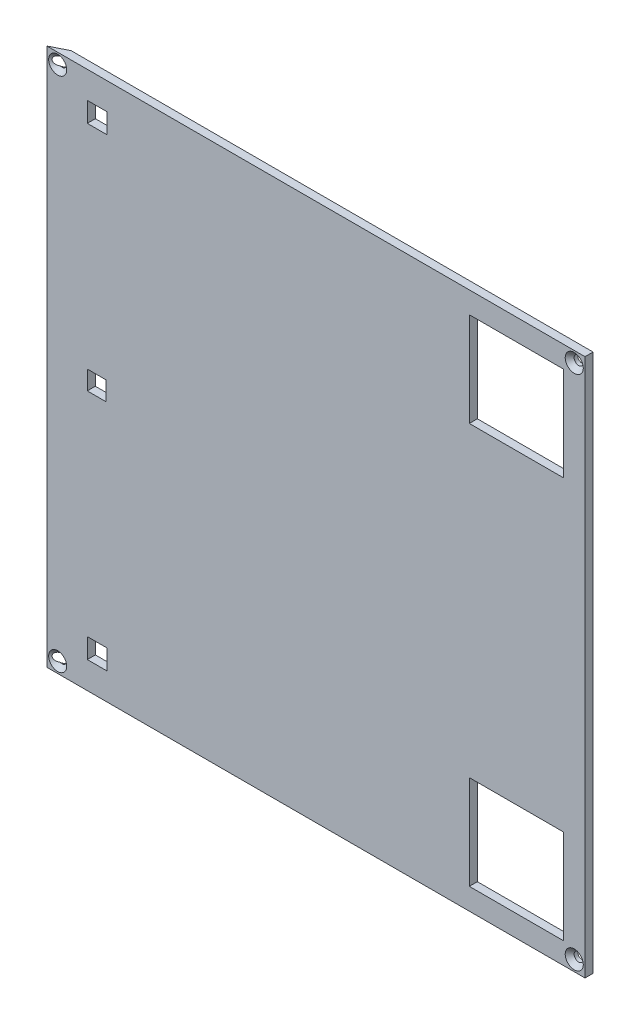
ISO-10303-21;
HEADER;
FILE_DESCRIPTION(('STEP AP214'),'2;1');
FILE_NAME('part.step','',(''),(''),'','','');
FILE_SCHEMA(('AUTOMOTIVE_DESIGN { 1 0 10303 214 1 1 1 1 }'));
ENDSEC;
DATA;
#1=APPLICATION_CONTEXT('core data for automotive mechanical design processes');
#2=APPLICATION_PROTOCOL_DEFINITION('international standard','automotive_design',2000,#1);
#3=PRODUCT_CONTEXT('',#1,'mechanical');
#4=PRODUCT('Part','Part','',(#3));
#5=PRODUCT_RELATED_PRODUCT_CATEGORY('part','',(#4));
#6=PRODUCT_DEFINITION_FORMATION('','',#4);
#7=PRODUCT_DEFINITION_CONTEXT('part definition',#1,'design');
#8=PRODUCT_DEFINITION('design','',#6,#7);
#9=PRODUCT_DEFINITION_SHAPE('','',#8);
#10=(LENGTH_UNIT() NAMED_UNIT(*) SI_UNIT(.MILLI.,.METRE.));
#11=(NAMED_UNIT(*) PLANE_ANGLE_UNIT() SI_UNIT($,.RADIAN.));
#12=(NAMED_UNIT(*) SI_UNIT($,.STERADIAN.) SOLID_ANGLE_UNIT());
#13=UNCERTAINTY_MEASURE_WITH_UNIT(LENGTH_MEASURE(1.E-05),#10,'distance_accuracy_value','');
#14=(GEOMETRIC_REPRESENTATION_CONTEXT(3) GLOBAL_UNCERTAINTY_ASSIGNED_CONTEXT((#13)) GLOBAL_UNIT_ASSIGNED_CONTEXT((#10,
#11,#12)) REPRESENTATION_CONTEXT('',''));
#15=CARTESIAN_POINT('',(0.,0.,0.));
#16=DIRECTION('',(0.,0.,1.));
#17=DIRECTION('',(1.,0.,0.));
#18=AXIS2_PLACEMENT_3D('',#15,#16,#17);
#19=CARTESIAN_POINT('',(4.,196.,0.));
#20=DIRECTION('',(0.,0.,1.));
#21=DIRECTION('',(1.,0.,0.));
#22=AXIS2_PLACEMENT_3D('',#19,#20,#21);
#23=CONICAL_SURFACE('',#22,3.36,0.785398163397445);
#24=CARTESIAN_POINT('',(4.,196.,0.));
#25=DIRECTION('',(0.,0.,1.));
#26=DIRECTION('',(1.,0.,0.));
#27=AXIS2_PLACEMENT_3D('',#24,#25,#26);
#28=CIRCLE('',#27,3.36);
#29=CARTESIAN_POINT('',(7.36,196.,0.));
#30=VERTEX_POINT('',#29);
#31=EDGE_CURVE('E216',#30,#30,#28,.T.);
#32=ORIENTED_EDGE('',*,*,#31,.T.);
#33=EDGE_LOOP('',(#32));
#34=FACE_BOUND('',#33,.T.);
#35=CARTESIAN_POINT('',(4.,196.,-1.66000000000002));
#36=DIRECTION('',(0.,0.,1.));
#37=DIRECTION('',(1.,0.,0.));
#38=AXIS2_PLACEMENT_3D('',#35,#36,#37);
#39=CIRCLE('',#38,1.69999999999999);
#40=CARTESIAN_POINT('',(3.32000000000006,194.441924263715,-1.66000000000002));
#41=VERTEX_POINT('',#40);
#42=CARTESIAN_POINT('',(3.32000000000006,197.558075736285,-1.66000000000002));
#43=VERTEX_POINT('',#42);
#44=EDGE_CURVE('E267',#41,#43,#39,.T.);
#45=ORIENTED_EDGE('',*,*,#44,.F.);
#46=CARTESIAN_POINT('',(3.09333333333334,196.,-1.54666666666666));
#47=DIRECTION('',(0.447213595499958,0.,0.894427190999916));
#48=DIRECTION('',(-0.894427190999916,0.,0.447213595499958));
#49=AXIS2_PLACEMENT_3D('',#46,#47,#48);
#50=ELLIPSE('',#49,2.02736829959983,1.5703927321958);
#51=EDGE_CURVE('E212',#43,#41,#50,.T.);
#52=ORIENTED_EDGE('',*,*,#51,.F.);
#53=EDGE_LOOP('',(#45,#52));
#54=FACE_BOUND('',#53,.T.);
#55=ADVANCED_FACE('F33',(#34,#54),#23,.F.);
#56=CARTESIAN_POINT('',(4.,196.,0.));
#57=DIRECTION('',(0.,0.,1.));
#58=DIRECTION('',(1.,0.,0.));
#59=AXIS2_PLACEMENT_3D('',#56,#57,#58);
#60=CYLINDRICAL_SURFACE('',#59,1.69999999999999);
#61=ORIENTED_EDGE('',*,*,#44,.T.);
#62=CARTESIAN_POINT('',(4.,196.,-1.99999999999999));
#63=DIRECTION('',(0.447213595499958,0.,0.894427190999916));
#64=DIRECTION('',(-0.894427190999916,0.,0.447213595499958));
#65=AXIS2_PLACEMENT_3D('',#62,#63,#64);
#66=ELLIPSE('',#65,1.90065778087481,1.69999999999999);
#67=EDGE_CURVE('E261',#41,#43,#66,.T.);
#68=ORIENTED_EDGE('',*,*,#67,.F.);
#69=EDGE_LOOP('',(#61,#68));
#70=FACE_BOUND('',#69,.T.);
#71=ADVANCED_FACE('F735',(#70),#60,.F.);
#72=CARTESIAN_POINT('',(4.,4.,0.));
#73=DIRECTION('',(0.,0.,1.));
#74=DIRECTION('',(1.,0.,0.));
#75=AXIS2_PLACEMENT_3D('',#72,#73,#74);
#76=CONICAL_SURFACE('',#75,3.36,0.785398163397445);
#77=CARTESIAN_POINT('',(4.,4.,0.));
#78=DIRECTION('',(0.,0.,1.));
#79=DIRECTION('',(1.,0.,0.));
#80=AXIS2_PLACEMENT_3D('',#77,#78,#79);
#81=CIRCLE('',#80,3.36);
#82=CARTESIAN_POINT('',(7.36,4.,0.));
#83=VERTEX_POINT('',#82);
#84=EDGE_CURVE('E217',#83,#83,#81,.T.);
#85=ORIENTED_EDGE('',*,*,#84,.T.);
#86=EDGE_LOOP('',(#85));
#87=FACE_BOUND('',#86,.T.);
#88=CARTESIAN_POINT('',(4.,4.,-1.66000000000002));
#89=DIRECTION('',(0.,0.,1.));
#90=DIRECTION('',(1.,0.,0.));
#91=AXIS2_PLACEMENT_3D('',#88,#89,#90);
#92=CIRCLE('',#91,1.69999999999999);
#93=CARTESIAN_POINT('',(3.32000000000006,2.441924263715,-1.66000000000002));
#94=VERTEX_POINT('',#93);
#95=CARTESIAN_POINT('',(3.32000000000006,5.558075736285,-1.66000000000002));
#96=VERTEX_POINT('',#95);
#97=EDGE_CURVE('E207',#94,#96,#92,.T.);
#98=ORIENTED_EDGE('',*,*,#97,.F.);
#99=CARTESIAN_POINT('',(3.09333333333334,4.,-1.54666666666666));
#100=DIRECTION('',(0.447213595499958,0.,0.894427190999916));
#101=DIRECTION('',(-0.894427190999916,0.,0.447213595499958));
#102=AXIS2_PLACEMENT_3D('',#99,#100,#101);
#103=ELLIPSE('',#102,2.02736829959983,1.5703927321958);
#104=EDGE_CURVE('E211',#96,#94,#103,.T.);
#105=ORIENTED_EDGE('',*,*,#104,.F.);
#106=EDGE_LOOP('',(#98,#105));
#107=FACE_BOUND('',#106,.T.);
#108=ADVANCED_FACE('F215',(#87,#107),#76,.F.);
#109=CARTESIAN_POINT('',(4.,4.,0.));
#110=DIRECTION('',(0.,0.,1.));
#111=DIRECTION('',(1.,0.,0.));
#112=AXIS2_PLACEMENT_3D('',#109,#110,#111);
#113=CYLINDRICAL_SURFACE('',#112,1.69999999999999);
#114=ORIENTED_EDGE('',*,*,#97,.T.);
#115=CARTESIAN_POINT('',(4.,4.,-1.99999999999999));
#116=DIRECTION('',(0.447213595499958,0.,0.894427190999916));
#117=DIRECTION('',(-0.894427190999916,0.,0.447213595499958));
#118=AXIS2_PLACEMENT_3D('',#115,#116,#117);
#119=ELLIPSE('',#118,1.90065778087481,1.69999999999999);
#120=EDGE_CURVE('E204',#94,#96,#119,.T.);
#121=ORIENTED_EDGE('',*,*,#120,.F.);
#122=EDGE_LOOP('',(#114,#121));
#123=FACE_BOUND('',#122,.T.);
#124=ADVANCED_FACE('F206',(#123),#113,.F.);
#125=CARTESIAN_POINT('',(160.,200.,-80.));
#126=DIRECTION('',(0.447213595499958,0.,0.894427190999916));
#127=DIRECTION('',(0.894427190999916,0.,-0.447213595499958));
#128=AXIS2_PLACEMENT_3D('',#125,#126,#127);
#129=PLANE('',#128);
#130=ORIENTED_EDGE('',*,*,#120,.T.);
#131=ORIENTED_EDGE('',*,*,#104,.T.);
#132=EDGE_LOOP('',(#130,#131));
#133=FACE_BOUND('',#132,.T.);
#134=ORIENTED_EDGE('',*,*,#67,.T.);
#135=ORIENTED_EDGE('',*,*,#51,.T.);
#136=EDGE_LOOP('',(#134,#135));
#137=FACE_BOUND('',#136,.T.);
#138=DIRECTION('',(-0.894427190999916,0.,0.447213595499958));
#139=VECTOR('',#138,1.);
#140=CARTESIAN_POINT('',(160.,200.,-80.));
#141=LINE('',#140,#139);
#142=CARTESIAN_POINT('',(6.00000000000003,200.,-3.00000000000001));
#143=VERTEX_POINT('',#142);
#144=CARTESIAN_POINT('',(0.,200.,0.));
#145=VERTEX_POINT('',#144);
#146=EDGE_CURVE('E233',#143,#145,#141,.T.);
#147=ORIENTED_EDGE('',*,*,#146,.F.);
#148=DIRECTION('',(0.,-1.,0.));
#149=VECTOR('',#148,1.);
#150=CARTESIAN_POINT('',(6.00000000000001,200.,-3.));
#151=LINE('',#150,#149);
#152=CARTESIAN_POINT('',(6.00000000000003,0.,-3.00000000000001));
#153=VERTEX_POINT('',#152);
#154=EDGE_CURVE('E41',#143,#153,#151,.T.);
#155=ORIENTED_EDGE('',*,*,#154,.T.);
#156=DIRECTION('',(-0.894427190999916,0.,0.447213595499958));
#157=VECTOR('',#156,1.);
#158=CARTESIAN_POINT('',(160.,0.,-80.));
#159=LINE('',#158,#157);
#160=CARTESIAN_POINT('',(0.,0.,0.));
#161=VERTEX_POINT('',#160);
#162=EDGE_CURVE('E255',#153,#161,#159,.T.);
#163=ORIENTED_EDGE('',*,*,#162,.T.);
#164=DIRECTION('',(0.,-1.,0.));
#165=VECTOR('',#164,1.);
#166=CARTESIAN_POINT('',(0.,200.,0.));
#167=LINE('',#166,#165);
#168=EDGE_CURVE('E242',#145,#161,#167,.T.);
#169=ORIENTED_EDGE('',*,*,#168,.F.);
#170=EDGE_LOOP('',(#147,#155,#163,#169));
#171=FACE_BOUND('',#170,.T.);
#172=ADVANCED_FACE('F35',(#133,#137,#171),#129,.F.);
#173=CARTESIAN_POINT('',(15.,10.,-3.));
#174=DIRECTION('',(1.,0.,0.));
#175=DIRECTION('',(0.,1.,0.));
#176=AXIS2_PLACEMENT_3D('',#173,#174,#175);
#177=PLANE('',#176);
#178=DIRECTION('',(0.,1.,0.));
#179=VECTOR('',#178,1.);
#180=CARTESIAN_POINT('',(15.,10.,0.));
#181=LINE('',#180,#179);
#182=CARTESIAN_POINT('',(15.,10.,0.));
#183=VERTEX_POINT('',#182);
#184=CARTESIAN_POINT('',(15.,17.4,0.));
#185=VERTEX_POINT('',#184);
#186=EDGE_CURVE('E417',#183,#185,#181,.T.);
#187=ORIENTED_EDGE('',*,*,#186,.F.);
#188=DIRECTION('',(0.,0.,1.));
#189=VECTOR('',#188,1.);
#190=CARTESIAN_POINT('',(15.,10.,-3.));
#191=LINE('',#190,#189);
#192=CARTESIAN_POINT('',(15.,10.,-3.));
#193=VERTEX_POINT('',#192);
#194=EDGE_CURVE('E435',#193,#183,#191,.T.);
#195=ORIENTED_EDGE('',*,*,#194,.F.);
#196=DIRECTION('',(0.,1.,0.));
#197=VECTOR('',#196,1.);
#198=CARTESIAN_POINT('',(15.,10.,-3.));
#199=LINE('',#198,#197);
#200=CARTESIAN_POINT('',(15.,17.4,-3.));
#201=VERTEX_POINT('',#200);
#202=EDGE_CURVE('E423',#193,#201,#199,.T.);
#203=ORIENTED_EDGE('',*,*,#202,.T.);
#204=DIRECTION('',(0.,0.,1.));
#205=VECTOR('',#204,1.);
#206=CARTESIAN_POINT('',(15.,17.4,-3.));
#207=LINE('',#206,#205);
#208=EDGE_CURVE('E437',#201,#185,#207,.T.);
#209=ORIENTED_EDGE('',*,*,#208,.T.);
#210=EDGE_LOOP('',(#187,#195,#203,#209));
#211=FACE_BOUND('',#210,.T.);
#212=ADVANCED_FACE('F462',(#211),#177,.T.);
#213=CARTESIAN_POINT('',(15.,10.,-3.));
#214=DIRECTION('',(0.,-1.,0.));
#215=DIRECTION('',(1.,0.,0.));
#216=AXIS2_PLACEMENT_3D('',#213,#214,#215);
#217=PLANE('',#216);
#218=DIRECTION('',(1.,0.,0.));
#219=VECTOR('',#218,1.);
#220=CARTESIAN_POINT('',(15.,10.,0.));
#221=LINE('',#220,#219);
#222=CARTESIAN_POINT('',(22.4,10.,0.));
#223=VERTEX_POINT('',#222);
#224=EDGE_CURVE('E406',#183,#223,#221,.T.);
#225=ORIENTED_EDGE('',*,*,#224,.T.);
#226=DIRECTION('',(0.,0.,1.));
#227=VECTOR('',#226,1.);
#228=CARTESIAN_POINT('',(22.4,10.,-3.));
#229=LINE('',#228,#227);
#230=CARTESIAN_POINT('',(22.4,10.,-3.));
#231=VERTEX_POINT('',#230);
#232=EDGE_CURVE('E425',#231,#223,#229,.T.);
#233=ORIENTED_EDGE('',*,*,#232,.F.);
#234=DIRECTION('',(1.,0.,0.));
#235=VECTOR('',#234,1.);
#236=CARTESIAN_POINT('',(15.,10.,-3.));
#237=LINE('',#236,#235);
#238=EDGE_CURVE('E413',#193,#231,#237,.T.);
#239=ORIENTED_EDGE('',*,*,#238,.F.);
#240=ORIENTED_EDGE('',*,*,#194,.T.);
#241=EDGE_LOOP('',(#225,#233,#239,#240));
#242=FACE_BOUND('',#241,.T.);
#243=ADVANCED_FACE('F460',(#242),#217,.F.);
#244=CARTESIAN_POINT('',(15.,17.4,-3.));
#245=DIRECTION('',(0.,-1.,0.));
#246=DIRECTION('',(0.,0.,-1.));
#247=AXIS2_PLACEMENT_3D('',#244,#245,#246);
#248=PLANE('',#247);
#249=DIRECTION('',(1.,0.,0.));
#250=VECTOR('',#249,1.);
#251=CARTESIAN_POINT('',(15.,17.4,0.));
#252=LINE('',#251,#250);
#253=CARTESIAN_POINT('',(22.4,17.4,0.));
#254=VERTEX_POINT('',#253);
#255=EDGE_CURVE('E430',#185,#254,#252,.T.);
#256=ORIENTED_EDGE('',*,*,#255,.F.);
#257=ORIENTED_EDGE('',*,*,#208,.F.);
#258=DIRECTION('',(1.,0.,0.));
#259=VECTOR('',#258,1.);
#260=CARTESIAN_POINT('',(15.,17.4,-3.));
#261=LINE('',#260,#259);
#262=CARTESIAN_POINT('',(22.4,17.4,-3.));
#263=VERTEX_POINT('',#262);
#264=EDGE_CURVE('E420',#201,#263,#261,.T.);
#265=ORIENTED_EDGE('',*,*,#264,.T.);
#266=DIRECTION('',(0.,0.,1.));
#267=VECTOR('',#266,1.);
#268=CARTESIAN_POINT('',(22.4,17.4,-3.));
#269=LINE('',#268,#267);
#270=EDGE_CURVE('E439',#263,#254,#269,.T.);
#271=ORIENTED_EDGE('',*,*,#270,.T.);
#272=EDGE_LOOP('',(#256,#257,#265,#271));
#273=FACE_BOUND('',#272,.T.);
#274=ADVANCED_FACE('F455',(#273),#248,.T.);
#275=CARTESIAN_POINT('',(22.4,190.,-3.));
#276=DIRECTION('',(-1.,0.,0.));
#277=DIRECTION('',(0.,-1.,0.));
#278=AXIS2_PLACEMENT_3D('',#275,#276,#277);
#279=PLANE('',#278);
#280=DIRECTION('',(0.,-1.,0.));
#281=VECTOR('',#280,1.);
#282=CARTESIAN_POINT('',(22.4,190.,0.));
#283=LINE('',#282,#281);
#284=CARTESIAN_POINT('',(22.4,190.,0.));
#285=VERTEX_POINT('',#284);
#286=CARTESIAN_POINT('',(22.4,182.6,0.));
#287=VERTEX_POINT('',#286);
#288=EDGE_CURVE('E384',#285,#287,#283,.T.);
#289=ORIENTED_EDGE('',*,*,#288,.F.);
#290=DIRECTION('',(0.,0.,1.));
#291=VECTOR('',#290,1.);
#292=CARTESIAN_POINT('',(22.4,190.,-3.));
#293=LINE('',#292,#291);
#294=CARTESIAN_POINT('',(22.4,190.,-3.));
#295=VERTEX_POINT('',#294);
#296=EDGE_CURVE('E403',#295,#285,#293,.T.);
#297=ORIENTED_EDGE('',*,*,#296,.F.);
#298=DIRECTION('',(0.,-1.,0.));
#299=VECTOR('',#298,1.);
#300=CARTESIAN_POINT('',(22.4,190.,-3.));
#301=LINE('',#300,#299);
#302=CARTESIAN_POINT('',(22.4,182.6,-3.));
#303=VERTEX_POINT('',#302);
#304=EDGE_CURVE('E390',#295,#303,#301,.T.);
#305=ORIENTED_EDGE('',*,*,#304,.T.);
#306=DIRECTION('',(0.,0.,1.));
#307=VECTOR('',#306,1.);
#308=CARTESIAN_POINT('',(22.4,182.6,-3.));
#309=LINE('',#308,#307);
#310=EDGE_CURVE('E407',#303,#287,#309,.T.);
#311=ORIENTED_EDGE('',*,*,#310,.T.);
#312=EDGE_LOOP('',(#289,#297,#305,#311));
#313=FACE_BOUND('',#312,.T.);
#314=ADVANCED_FACE('F529',(#313),#279,.T.);
#315=CARTESIAN_POINT('',(15.,190.,-3.));
#316=DIRECTION('',(0.,-1.,0.));
#317=DIRECTION('',(1.,0.,0.));
#318=AXIS2_PLACEMENT_3D('',#315,#316,#317);
#319=PLANE('',#318);
#320=DIRECTION('',(1.,0.,0.));
#321=VECTOR('',#320,1.);
#322=CARTESIAN_POINT('',(15.,190.,0.));
#323=LINE('',#322,#321);
#324=CARTESIAN_POINT('',(15.,190.,0.));
#325=VERTEX_POINT('',#324);
#326=EDGE_CURVE('E374',#325,#285,#323,.T.);
#327=ORIENTED_EDGE('',*,*,#326,.F.);
#328=DIRECTION('',(0.,0.,1.));
#329=VECTOR('',#328,1.);
#330=CARTESIAN_POINT('',(15.,190.,-3.));
#331=LINE('',#330,#329);
#332=CARTESIAN_POINT('',(15.,190.,-3.));
#333=VERTEX_POINT('',#332);
#334=EDGE_CURVE('E392',#333,#325,#331,.T.);
#335=ORIENTED_EDGE('',*,*,#334,.F.);
#336=DIRECTION('',(1.,0.,0.));
#337=VECTOR('',#336,1.);
#338=CARTESIAN_POINT('',(15.,190.,-3.));
#339=LINE('',#338,#337);
#340=EDGE_CURVE('E381',#333,#295,#339,.T.);
#341=ORIENTED_EDGE('',*,*,#340,.T.);
#342=ORIENTED_EDGE('',*,*,#296,.T.);
#343=EDGE_LOOP('',(#327,#335,#341,#342));
#344=FACE_BOUND('',#343,.T.);
#345=ADVANCED_FACE('F519',(#344),#319,.T.);
#346=CARTESIAN_POINT('',(15.,182.6,-3.));
#347=DIRECTION('',(0.,-1.,0.));
#348=DIRECTION('',(0.,0.,-1.));
#349=AXIS2_PLACEMENT_3D('',#346,#347,#348);
#350=PLANE('',#349);
#351=DIRECTION('',(1.,0.,0.));
#352=VECTOR('',#351,1.);
#353=CARTESIAN_POINT('',(15.,182.6,0.));
#354=LINE('',#353,#352);
#355=CARTESIAN_POINT('',(15.,182.6,0.));
#356=VERTEX_POINT('',#355);
#357=EDGE_CURVE('E398',#356,#287,#354,.T.);
#358=ORIENTED_EDGE('',*,*,#357,.T.);
#359=ORIENTED_EDGE('',*,*,#310,.F.);
#360=DIRECTION('',(1.,0.,0.));
#361=VECTOR('',#360,1.);
#362=CARTESIAN_POINT('',(15.,182.6,-3.));
#363=LINE('',#362,#361);
#364=CARTESIAN_POINT('',(15.,182.6,-3.));
#365=VERTEX_POINT('',#364);
#366=EDGE_CURVE('E387',#365,#303,#363,.T.);
#367=ORIENTED_EDGE('',*,*,#366,.F.);
#368=DIRECTION('',(0.,0.,1.));
#369=VECTOR('',#368,1.);
#370=CARTESIAN_POINT('',(15.,182.6,-3.));
#371=LINE('',#370,#369);
#372=EDGE_CURVE('E409',#365,#356,#371,.T.);
#373=ORIENTED_EDGE('',*,*,#372,.T.);
#374=EDGE_LOOP('',(#358,#359,#367,#373));
#375=FACE_BOUND('',#374,.T.);
#376=ADVANCED_FACE('F532',(#375),#350,.F.);
#377=CARTESIAN_POINT('',(22.0399999999999,96.48,-3.));
#378=DIRECTION('',(0.,-1.,0.));
#379=DIRECTION('',(0.,0.,-1.));
#380=AXIS2_PLACEMENT_3D('',#377,#378,#379);
#381=PLANE('',#380);
#382=DIRECTION('',(1.,0.,0.));
#383=VECTOR('',#382,1.);
#384=CARTESIAN_POINT('',(22.0399999999999,96.48,0.));
#385=LINE('',#384,#383);
#386=CARTESIAN_POINT('',(15.,96.48,0.));
#387=VERTEX_POINT('',#386);
#388=CARTESIAN_POINT('',(22.0399999999999,96.48,0.));
#389=VERTEX_POINT('',#388);
#390=EDGE_CURVE('E353',#387,#389,#385,.T.);
#391=ORIENTED_EDGE('',*,*,#390,.T.);
#392=DIRECTION('',(0.,0.,1.));
#393=VECTOR('',#392,1.);
#394=CARTESIAN_POINT('',(22.0399999999999,96.48,-3.));
#395=LINE('',#394,#393);
#396=CARTESIAN_POINT('',(22.0399999999999,96.48,-3.));
#397=VERTEX_POINT('',#396);
#398=EDGE_CURVE('E372',#397,#389,#395,.T.);
#399=ORIENTED_EDGE('',*,*,#398,.F.);
#400=DIRECTION('',(1.,0.,0.));
#401=VECTOR('',#400,1.);
#402=CARTESIAN_POINT('',(22.0399999999999,96.48,-3.));
#403=LINE('',#402,#401);
#404=CARTESIAN_POINT('',(15.,96.48,-3.));
#405=VERTEX_POINT('',#404);
#406=EDGE_CURVE('E359',#405,#397,#403,.T.);
#407=ORIENTED_EDGE('',*,*,#406,.F.);
#408=DIRECTION('',(0.,0.,1.));
#409=VECTOR('',#408,1.);
#410=CARTESIAN_POINT('',(15.,96.48,-3.));
#411=LINE('',#410,#409);
#412=EDGE_CURVE('E375',#405,#387,#411,.T.);
#413=ORIENTED_EDGE('',*,*,#412,.T.);
#414=EDGE_LOOP('',(#391,#399,#407,#413));
#415=FACE_BOUND('',#414,.T.);
#416=ADVANCED_FACE('F534',(#415),#381,.F.);
#417=CARTESIAN_POINT('',(22.0399999999999,103.52,-3.));
#418=DIRECTION('',(1.,0.,0.));
#419=DIRECTION('',(0.,1.,0.));
#420=AXIS2_PLACEMENT_3D('',#417,#418,#419);
#421=PLANE('',#420);
#422=DIRECTION('',(0.,1.,0.));
#423=VECTOR('',#422,1.);
#424=CARTESIAN_POINT('',(22.0399999999999,103.52,0.));
#425=LINE('',#424,#423);
#426=CARTESIAN_POINT('',(22.0399999999999,103.52,0.));
#427=VERTEX_POINT('',#426);
#428=EDGE_CURVE('E342',#389,#427,#425,.T.);
#429=ORIENTED_EDGE('',*,*,#428,.T.);
#430=DIRECTION('',(0.,0.,1.));
#431=VECTOR('',#430,1.);
#432=CARTESIAN_POINT('',(22.0399999999999,103.52,-3.));
#433=LINE('',#432,#431);
#434=CARTESIAN_POINT('',(22.0399999999999,103.52,-3.));
#435=VERTEX_POINT('',#434);
#436=EDGE_CURVE('E362',#435,#427,#433,.T.);
#437=ORIENTED_EDGE('',*,*,#436,.F.);
#438=DIRECTION('',(0.,1.,0.));
#439=VECTOR('',#438,1.);
#440=CARTESIAN_POINT('',(22.0399999999999,103.52,-3.));
#441=LINE('',#440,#439);
#442=EDGE_CURVE('E349',#397,#435,#441,.T.);
#443=ORIENTED_EDGE('',*,*,#442,.F.);
#444=ORIENTED_EDGE('',*,*,#398,.T.);
#445=EDGE_LOOP('',(#429,#437,#443,#444));
#446=FACE_BOUND('',#445,.T.);
#447=ADVANCED_FACE('F540',(#446),#421,.F.);
#448=CARTESIAN_POINT('',(15.,103.52,-3.));
#449=DIRECTION('',(-1.,0.,0.));
#450=DIRECTION('',(0.,-1.,0.));
#451=AXIS2_PLACEMENT_3D('',#448,#449,#450);
#452=PLANE('',#451);
#453=DIRECTION('',(0.,-1.,0.));
#454=VECTOR('',#453,1.);
#455=CARTESIAN_POINT('',(15.,103.52,0.));
#456=LINE('',#455,#454);
#457=CARTESIAN_POINT('',(15.,103.52,0.));
#458=VERTEX_POINT('',#457);
#459=EDGE_CURVE('E367',#458,#387,#456,.T.);
#460=ORIENTED_EDGE('',*,*,#459,.T.);
#461=ORIENTED_EDGE('',*,*,#412,.F.);
#462=DIRECTION('',(0.,-1.,0.));
#463=VECTOR('',#462,1.);
#464=CARTESIAN_POINT('',(15.,103.52,-3.));
#465=LINE('',#464,#463);
#466=CARTESIAN_POINT('',(15.,103.52,-3.));
#467=VERTEX_POINT('',#466);
#468=EDGE_CURVE('E356',#467,#405,#465,.T.);
#469=ORIENTED_EDGE('',*,*,#468,.F.);
#470=DIRECTION('',(0.,0.,1.));
#471=VECTOR('',#470,1.);
#472=CARTESIAN_POINT('',(15.,103.52,-3.));
#473=LINE('',#472,#471);
#474=EDGE_CURVE('E377',#467,#458,#473,.T.);
#475=ORIENTED_EDGE('',*,*,#474,.T.);
#476=EDGE_LOOP('',(#460,#461,#469,#475));
#477=FACE_BOUND('',#476,.T.);
#478=ADVANCED_FACE('F560',(#477),#452,.F.);
#479=CARTESIAN_POINT('',(192.,157.,-3.));
#480=DIRECTION('',(0.,-1.,0.));
#481=DIRECTION('',(0.,0.,-1.));
#482=AXIS2_PLACEMENT_3D('',#479,#480,#481);
#483=PLANE('',#482);
#484=DIRECTION('',(1.,0.,0.));
#485=VECTOR('',#484,1.);
#486=CARTESIAN_POINT('',(192.,157.,0.));
#487=LINE('',#486,#485);
#488=CARTESIAN_POINT('',(157.,157.,0.));
#489=VERTEX_POINT('',#488);
#490=CARTESIAN_POINT('',(192.,157.,0.));
#491=VERTEX_POINT('',#490);
#492=EDGE_CURVE('E321',#489,#491,#487,.T.);
#493=ORIENTED_EDGE('',*,*,#492,.T.);
#494=DIRECTION('',(0.,0.,1.));
#495=VECTOR('',#494,1.);
#496=CARTESIAN_POINT('',(192.,157.,-3.));
#497=LINE('',#496,#495);
#498=CARTESIAN_POINT('',(192.,157.,-3.));
#499=VERTEX_POINT('',#498);
#500=EDGE_CURVE('E340',#499,#491,#497,.T.);
#501=ORIENTED_EDGE('',*,*,#500,.F.);
#502=DIRECTION('',(1.,0.,0.));
#503=VECTOR('',#502,1.);
#504=CARTESIAN_POINT('',(192.,157.,-3.));
#505=LINE('',#504,#503);
#506=CARTESIAN_POINT('',(157.,157.,-3.));
#507=VERTEX_POINT('',#506);
#508=EDGE_CURVE('E327',#507,#499,#505,.T.);
#509=ORIENTED_EDGE('',*,*,#508,.F.);
#510=DIRECTION('',(0.,0.,1.));
#511=VECTOR('',#510,1.);
#512=CARTESIAN_POINT('',(157.,157.,-3.));
#513=LINE('',#512,#511);
#514=EDGE_CURVE('E343',#507,#489,#513,.T.);
#515=ORIENTED_EDGE('',*,*,#514,.T.);
#516=EDGE_LOOP('',(#493,#501,#509,#515));
#517=FACE_BOUND('',#516,.T.);
#518=ADVANCED_FACE('F566',(#517),#483,.F.);
#519=CARTESIAN_POINT('',(192.,192.,-3.));
#520=DIRECTION('',(1.,0.,0.));
#521=DIRECTION('',(0.,0.,-1.));
#522=AXIS2_PLACEMENT_3D('',#519,#520,#521);
#523=PLANE('',#522);
#524=DIRECTION('',(0.,1.,0.));
#525=VECTOR('',#524,1.);
#526=CARTESIAN_POINT('',(192.,192.,0.));
#527=LINE('',#526,#525);
#528=CARTESIAN_POINT('',(192.,192.,0.));
#529=VERTEX_POINT('',#528);
#530=EDGE_CURVE('E310',#491,#529,#527,.T.);
#531=ORIENTED_EDGE('',*,*,#530,.T.);
#532=DIRECTION('',(0.,0.,1.));
#533=VECTOR('',#532,1.);
#534=CARTESIAN_POINT('',(192.,192.,-3.));
#535=LINE('',#534,#533);
#536=CARTESIAN_POINT('',(192.,192.,-3.));
#537=VERTEX_POINT('',#536);
#538=EDGE_CURVE('E330',#537,#529,#535,.T.);
#539=ORIENTED_EDGE('',*,*,#538,.F.);
#540=DIRECTION('',(0.,1.,0.));
#541=VECTOR('',#540,1.);
#542=CARTESIAN_POINT('',(192.,192.,-3.));
#543=LINE('',#542,#541);
#544=EDGE_CURVE('E317',#499,#537,#543,.T.);
#545=ORIENTED_EDGE('',*,*,#544,.F.);
#546=ORIENTED_EDGE('',*,*,#500,.T.);
#547=EDGE_LOOP('',(#531,#539,#545,#546));
#548=FACE_BOUND('',#547,.T.);
#549=ADVANCED_FACE('F604',(#548),#523,.F.);
#550=CARTESIAN_POINT('',(157.,192.,-3.));
#551=DIRECTION('',(-1.,0.,0.));
#552=DIRECTION('',(0.,0.,1.));
#553=AXIS2_PLACEMENT_3D('',#550,#551,#552);
#554=PLANE('',#553);
#555=DIRECTION('',(0.,-1.,0.));
#556=VECTOR('',#555,1.);
#557=CARTESIAN_POINT('',(157.,192.,0.));
#558=LINE('',#557,#556);
#559=CARTESIAN_POINT('',(157.,192.,0.));
#560=VERTEX_POINT('',#559);
#561=EDGE_CURVE('E335',#560,#489,#558,.T.);
#562=ORIENTED_EDGE('',*,*,#561,.T.);
#563=ORIENTED_EDGE('',*,*,#514,.F.);
#564=DIRECTION('',(0.,-1.,0.));
#565=VECTOR('',#564,1.);
#566=CARTESIAN_POINT('',(157.,192.,-3.));
#567=LINE('',#566,#565);
#568=CARTESIAN_POINT('',(157.,192.,-3.));
#569=VERTEX_POINT('',#568);
#570=EDGE_CURVE('E324',#569,#507,#567,.T.);
#571=ORIENTED_EDGE('',*,*,#570,.F.);
#572=DIRECTION('',(0.,0.,1.));
#573=VECTOR('',#572,1.);
#574=CARTESIAN_POINT('',(157.,192.,-3.));
#575=LINE('',#574,#573);
#576=EDGE_CURVE('E345',#569,#560,#575,.T.);
#577=ORIENTED_EDGE('',*,*,#576,.T.);
#578=EDGE_LOOP('',(#562,#563,#571,#577));
#579=FACE_BOUND('',#578,.T.);
#580=ADVANCED_FACE('F597',(#579),#554,.F.);
#581=CARTESIAN_POINT('',(192.,8.00000000000001,-3.));
#582=DIRECTION('',(0.,1.,0.));
#583=DIRECTION('',(0.,0.,1.));
#584=AXIS2_PLACEMENT_3D('',#581,#582,#583);
#585=PLANE('',#584);
#586=DIRECTION('',(-1.,0.,0.));
#587=VECTOR('',#586,1.);
#588=CARTESIAN_POINT('',(192.,8.00000000000001,0.));
#589=LINE('',#588,#587);
#590=CARTESIAN_POINT('',(192.,8.00000000000001,0.));
#591=VERTEX_POINT('',#590);
#592=CARTESIAN_POINT('',(157.,8.00000000000001,0.));
#593=VERTEX_POINT('',#592);
#594=EDGE_CURVE('E289',#591,#593,#589,.T.);
#595=ORIENTED_EDGE('',*,*,#594,.F.);
#596=DIRECTION('',(0.,0.,1.));
#597=VECTOR('',#596,1.);
#598=CARTESIAN_POINT('',(192.,8.00000000000001,-3.));
#599=LINE('',#598,#597);
#600=CARTESIAN_POINT('',(192.,8.00000000000001,-3.));
#601=VERTEX_POINT('',#600);
#602=EDGE_CURVE('E307',#601,#591,#599,.T.);
#603=ORIENTED_EDGE('',*,*,#602,.F.);
#604=DIRECTION('',(-1.,0.,0.));
#605=VECTOR('',#604,1.);
#606=CARTESIAN_POINT('',(192.,8.00000000000001,-3.));
#607=LINE('',#606,#605);
#608=CARTESIAN_POINT('',(157.,8.00000000000001,-3.));
#609=VERTEX_POINT('',#608);
#610=EDGE_CURVE('E294',#601,#609,#607,.T.);
#611=ORIENTED_EDGE('',*,*,#610,.T.);
#612=DIRECTION('',(0.,0.,1.));
#613=VECTOR('',#612,1.);
#614=CARTESIAN_POINT('',(157.,8.00000000000001,-3.));
#615=LINE('',#614,#613);
#616=EDGE_CURVE('E311',#609,#593,#615,.T.);
#617=ORIENTED_EDGE('',*,*,#616,.T.);
#618=EDGE_LOOP('',(#595,#603,#611,#617));
#619=FACE_BOUND('',#618,.T.);
#620=ADVANCED_FACE('F593',(#619),#585,.T.);
#621=CARTESIAN_POINT('',(192.,8.00000000000001,-3.));
#622=DIRECTION('',(-1.,0.,0.));
#623=DIRECTION('',(0.,0.,1.));
#624=AXIS2_PLACEMENT_3D('',#621,#622,#623);
#625=PLANE('',#624);
#626=DIRECTION('',(0.,-1.,0.));
#627=VECTOR('',#626,1.);
#628=CARTESIAN_POINT('',(192.,8.00000000000001,0.));
#629=LINE('',#628,#627);
#630=CARTESIAN_POINT('',(192.,43.,0.));
#631=VERTEX_POINT('',#630);
#632=EDGE_CURVE('E285',#631,#591,#629,.T.);
#633=ORIENTED_EDGE('',*,*,#632,.F.);
#634=DIRECTION('',(0.,0.,1.));
#635=VECTOR('',#634,1.);
#636=CARTESIAN_POINT('',(192.,43.,-3.));
#637=LINE('',#636,#635);
#638=CARTESIAN_POINT('',(192.,43.,-3.));
#639=VERTEX_POINT('',#638);
#640=EDGE_CURVE('E296',#639,#631,#637,.T.);
#641=ORIENTED_EDGE('',*,*,#640,.F.);
#642=DIRECTION('',(0.,-1.,0.));
#643=VECTOR('',#642,1.);
#644=CARTESIAN_POINT('',(192.,8.00000000000001,-3.));
#645=LINE('',#644,#643);
#646=EDGE_CURVE('E286',#639,#601,#645,.T.);
#647=ORIENTED_EDGE('',*,*,#646,.T.);
#648=ORIENTED_EDGE('',*,*,#602,.T.);
#649=EDGE_LOOP('',(#633,#641,#647,#648));
#650=FACE_BOUND('',#649,.T.);
#651=ADVANCED_FACE('F504',(#650),#625,.T.);
#652=CARTESIAN_POINT('',(157.,8.00000000000001,-3.));
#653=DIRECTION('',(1.,0.,0.));
#654=DIRECTION('',(0.,0.,-1.));
#655=AXIS2_PLACEMENT_3D('',#652,#653,#654);
#656=PLANE('',#655);
#657=DIRECTION('',(0.,1.,0.));
#658=VECTOR('',#657,1.);
#659=CARTESIAN_POINT('',(157.,8.00000000000001,0.));
#660=LINE('',#659,#658);
#661=CARTESIAN_POINT('',(157.,43.,0.));
#662=VERTEX_POINT('',#661);
#663=EDGE_CURVE('E302',#593,#662,#660,.T.);
#664=ORIENTED_EDGE('',*,*,#663,.F.);
#665=ORIENTED_EDGE('',*,*,#616,.F.);
#666=DIRECTION('',(0.,1.,0.));
#667=VECTOR('',#666,1.);
#668=CARTESIAN_POINT('',(157.,8.00000000000001,-3.));
#669=LINE('',#668,#667);
#670=CARTESIAN_POINT('',(157.,43.,-3.));
#671=VERTEX_POINT('',#670);
#672=EDGE_CURVE('E291',#609,#671,#669,.T.);
#673=ORIENTED_EDGE('',*,*,#672,.T.);
#674=DIRECTION('',(0.,0.,1.));
#675=VECTOR('',#674,1.);
#676=CARTESIAN_POINT('',(157.,43.,-3.));
#677=LINE('',#676,#675);
#678=EDGE_CURVE('E313',#671,#662,#677,.T.);
#679=ORIENTED_EDGE('',*,*,#678,.T.);
#680=EDGE_LOOP('',(#664,#665,#673,#679));
#681=FACE_BOUND('',#680,.T.);
#682=ADVANCED_FACE('F495',(#681),#656,.T.);
#683=CARTESIAN_POINT('',(0.,200.,0.));
#684=DIRECTION('',(0.,0.,-1.));
#685=DIRECTION('',(-1.,0.,0.));
#686=AXIS2_PLACEMENT_3D('',#683,#684,#685);
#687=PLANE('',#686);
#688=ORIENTED_EDGE('',*,*,#84,.F.);
#689=EDGE_LOOP('',(#688));
#690=FACE_BOUND('',#689,.T.);
#691=ORIENTED_EDGE('',*,*,#31,.F.);
#692=EDGE_LOOP('',(#691));
#693=FACE_BOUND('',#692,.T.);
#694=CARTESIAN_POINT('',(196.,196.,0.));
#695=DIRECTION('',(0.,0.,1.));
#696=DIRECTION('',(1.,0.,0.));
#697=AXIS2_PLACEMENT_3D('',#694,#695,#696);
#698=CIRCLE('',#697,3.36);
#699=CARTESIAN_POINT('',(199.36,196.,0.));
#700=VERTEX_POINT('',#699);
#701=EDGE_CURVE('E269',#700,#700,#698,.T.);
#702=ORIENTED_EDGE('',*,*,#701,.F.);
#703=EDGE_LOOP('',(#702));
#704=FACE_BOUND('',#703,.T.);
#705=CARTESIAN_POINT('',(196.,4.,0.));
#706=DIRECTION('',(0.,0.,1.));
#707=DIRECTION('',(1.,0.,0.));
#708=AXIS2_PLACEMENT_3D('',#705,#706,#707);
#709=CIRCLE('',#708,3.36);
#710=CARTESIAN_POINT('',(199.36,4.,0.));
#711=VERTEX_POINT('',#710);
#712=EDGE_CURVE('E279',#711,#711,#709,.T.);
#713=ORIENTED_EDGE('',*,*,#712,.F.);
#714=EDGE_LOOP('',(#713));
#715=FACE_BOUND('',#714,.T.);
#716=ORIENTED_EDGE('',*,*,#326,.T.);
#717=ORIENTED_EDGE('',*,*,#288,.T.);
#718=ORIENTED_EDGE('',*,*,#357,.F.);
#719=DIRECTION('',(0.,-1.,0.));
#720=VECTOR('',#719,1.);
#721=CARTESIAN_POINT('',(15.,190.,0.));
#722=LINE('',#721,#720);
#723=EDGE_CURVE('E395',#325,#356,#722,.T.);
#724=ORIENTED_EDGE('',*,*,#723,.F.);
#725=EDGE_LOOP('',(#716,#717,#718,#724));
#726=FACE_BOUND('',#725,.T.);
#727=DIRECTION('',(0.,1.,0.));
#728=VECTOR('',#727,1.);
#729=CARTESIAN_POINT('',(22.4,10.,0.));
#730=LINE('',#729,#728);
#731=EDGE_CURVE('E427',#223,#254,#730,.T.);
#732=ORIENTED_EDGE('',*,*,#731,.F.);
#733=ORIENTED_EDGE('',*,*,#224,.F.);
#734=ORIENTED_EDGE('',*,*,#186,.T.);
#735=ORIENTED_EDGE('',*,*,#255,.T.);
#736=EDGE_LOOP('',(#732,#733,#734,#735));
#737=FACE_BOUND('',#736,.T.);
#738=DIRECTION('',(1.,0.,0.));
#739=VECTOR('',#738,1.);
#740=CARTESIAN_POINT('',(0.,0.,0.));
#741=LINE('',#740,#739);
#742=CARTESIAN_POINT('',(200.,0.,0.));
#743=VERTEX_POINT('',#742);
#744=EDGE_CURVE('E248',#161,#743,#741,.T.);
#745=ORIENTED_EDGE('',*,*,#744,.T.);
#746=DIRECTION('',(0.,-1.,0.));
#747=VECTOR('',#746,1.);
#748=CARTESIAN_POINT('',(200.,200.,0.));
#749=LINE('',#748,#747);
#750=CARTESIAN_POINT('',(200.,200.,0.));
#751=VERTEX_POINT('',#750);
#752=EDGE_CURVE('E254',#751,#743,#749,.T.);
#753=ORIENTED_EDGE('',*,*,#752,.F.);
#754=DIRECTION('',(1.,0.,0.));
#755=VECTOR('',#754,1.);
#756=CARTESIAN_POINT('',(0.,200.,0.));
#757=LINE('',#756,#755);
#758=EDGE_CURVE('E243',#145,#751,#757,.T.);
#759=ORIENTED_EDGE('',*,*,#758,.F.);
#760=ORIENTED_EDGE('',*,*,#168,.T.);
#761=EDGE_LOOP('',(#745,#753,#759,#760));
#762=FACE_BOUND('',#761,.T.);
#763=DIRECTION('',(-1.,0.,0.));
#764=VECTOR('',#763,1.);
#765=CARTESIAN_POINT('',(22.0399999999999,103.52,0.));
#766=LINE('',#765,#764);
#767=EDGE_CURVE('E364',#427,#458,#766,.T.);
#768=ORIENTED_EDGE('',*,*,#767,.F.);
#769=ORIENTED_EDGE('',*,*,#428,.F.);
#770=ORIENTED_EDGE('',*,*,#390,.F.);
#771=ORIENTED_EDGE('',*,*,#459,.F.);
#772=EDGE_LOOP('',(#768,#769,#770,#771));
#773=FACE_BOUND('',#772,.T.);
#774=DIRECTION('',(-1.,0.,0.));
#775=VECTOR('',#774,1.);
#776=CARTESIAN_POINT('',(192.,192.,0.));
#777=LINE('',#776,#775);
#778=EDGE_CURVE('E332',#529,#560,#777,.T.);
#779=ORIENTED_EDGE('',*,*,#778,.F.);
#780=ORIENTED_EDGE('',*,*,#530,.F.);
#781=ORIENTED_EDGE('',*,*,#492,.F.);
#782=ORIENTED_EDGE('',*,*,#561,.F.);
#783=EDGE_LOOP('',(#779,#780,#781,#782));
#784=FACE_BOUND('',#783,.T.);
#785=ORIENTED_EDGE('',*,*,#632,.T.);
#786=ORIENTED_EDGE('',*,*,#594,.T.);
#787=ORIENTED_EDGE('',*,*,#663,.T.);
#788=DIRECTION('',(1.,0.,0.));
#789=VECTOR('',#788,1.);
#790=CARTESIAN_POINT('',(192.,43.,0.));
#791=LINE('',#790,#789);
#792=EDGE_CURVE('E299',#662,#631,#791,.T.);
#793=ORIENTED_EDGE('',*,*,#792,.T.);
#794=EDGE_LOOP('',(#785,#786,#787,#793));
#795=FACE_BOUND('',#794,.T.);
#796=ADVANCED_FACE('F449',(#690,#693,#704,#715,#726,#737,#762,#773,#784,#795),#687,.F.);
#797=CARTESIAN_POINT('',(192.,43.,-3.));
#798=DIRECTION('',(0.,-1.,0.));
#799=DIRECTION('',(0.,0.,-1.));
#800=AXIS2_PLACEMENT_3D('',#797,#798,#799);
#801=PLANE('',#800);
#802=ORIENTED_EDGE('',*,*,#792,.F.);
#803=ORIENTED_EDGE('',*,*,#678,.F.);
#804=DIRECTION('',(1.,0.,0.));
#805=VECTOR('',#804,1.);
#806=CARTESIAN_POINT('',(192.,43.,-3.));
#807=LINE('',#806,#805);
#808=EDGE_CURVE('E288',#671,#639,#807,.T.);
#809=ORIENTED_EDGE('',*,*,#808,.T.);
#810=ORIENTED_EDGE('',*,*,#640,.T.);
#811=EDGE_LOOP('',(#802,#803,#809,#810));
#812=FACE_BOUND('',#811,.T.);
#813=ADVANCED_FACE('F494',(#812),#801,.T.);
#814=CARTESIAN_POINT('',(192.,192.,-3.));
#815=DIRECTION('',(0.,1.,0.));
#816=DIRECTION('',(0.,0.,1.));
#817=AXIS2_PLACEMENT_3D('',#814,#815,#816);
#818=PLANE('',#817);
#819=ORIENTED_EDGE('',*,*,#778,.T.);
#820=ORIENTED_EDGE('',*,*,#576,.F.);
#821=DIRECTION('',(-1.,0.,0.));
#822=VECTOR('',#821,1.);
#823=CARTESIAN_POINT('',(192.,192.,-3.));
#824=LINE('',#823,#822);
#825=EDGE_CURVE('E320',#537,#569,#824,.T.);
#826=ORIENTED_EDGE('',*,*,#825,.F.);
#827=ORIENTED_EDGE('',*,*,#538,.T.);
#828=EDGE_LOOP('',(#819,#820,#826,#827));
#829=FACE_BOUND('',#828,.T.);
#830=ADVANCED_FACE('F501',(#829),#818,.F.);
#831=CARTESIAN_POINT('',(22.0399999999999,103.52,-3.));
#832=DIRECTION('',(0.,1.,0.));
#833=DIRECTION('',(0.,0.,1.));
#834=AXIS2_PLACEMENT_3D('',#831,#832,#833);
#835=PLANE('',#834);
#836=ORIENTED_EDGE('',*,*,#767,.T.);
#837=ORIENTED_EDGE('',*,*,#474,.F.);
#838=DIRECTION('',(-1.,0.,0.));
#839=VECTOR('',#838,1.);
#840=CARTESIAN_POINT('',(22.0399999999999,103.52,-3.));
#841=LINE('',#840,#839);
#842=EDGE_CURVE('E352',#435,#467,#841,.T.);
#843=ORIENTED_EDGE('',*,*,#842,.F.);
#844=ORIENTED_EDGE('',*,*,#436,.T.);
#845=EDGE_LOOP('',(#836,#837,#843,#844));
#846=FACE_BOUND('',#845,.T.);
#847=ADVANCED_FACE('F547',(#846),#835,.F.);
#848=CARTESIAN_POINT('',(15.,190.,-3.));
#849=DIRECTION('',(-1.,0.,0.));
#850=DIRECTION('',(0.,-1.,0.));
#851=AXIS2_PLACEMENT_3D('',#848,#849,#850);
#852=PLANE('',#851);
#853=ORIENTED_EDGE('',*,*,#723,.T.);
#854=ORIENTED_EDGE('',*,*,#372,.F.);
#855=DIRECTION('',(0.,-1.,0.));
#856=VECTOR('',#855,1.);
#857=CARTESIAN_POINT('',(15.,190.,-3.));
#858=LINE('',#857,#856);
#859=EDGE_CURVE('E383',#333,#365,#858,.T.);
#860=ORIENTED_EDGE('',*,*,#859,.F.);
#861=ORIENTED_EDGE('',*,*,#334,.T.);
#862=EDGE_LOOP('',(#853,#854,#860,#861));
#863=FACE_BOUND('',#862,.T.);
#864=ADVANCED_FACE('F523',(#863),#852,.F.);
#865=CARTESIAN_POINT('',(22.4,10.,-3.));
#866=DIRECTION('',(1.,0.,0.));
#867=DIRECTION('',(0.,1.,0.));
#868=AXIS2_PLACEMENT_3D('',#865,#866,#867);
#869=PLANE('',#868);
#870=ORIENTED_EDGE('',*,*,#731,.T.);
#871=ORIENTED_EDGE('',*,*,#270,.F.);
#872=DIRECTION('',(0.,1.,0.));
#873=VECTOR('',#872,1.);
#874=CARTESIAN_POINT('',(22.4,10.,-3.));
#875=LINE('',#874,#873);
#876=EDGE_CURVE('E416',#231,#263,#875,.T.);
#877=ORIENTED_EDGE('',*,*,#876,.F.);
#878=ORIENTED_EDGE('',*,*,#232,.T.);
#879=EDGE_LOOP('',(#870,#871,#877,#878));
#880=FACE_BOUND('',#879,.T.);
#881=ADVANCED_FACE('F444',(#880),#869,.F.);
#882=CARTESIAN_POINT('',(200.,200.,0.));
#883=DIRECTION('',(-1.,0.,0.));
#884=DIRECTION('',(0.,0.,1.));
#885=AXIS2_PLACEMENT_3D('',#882,#883,#884);
#886=PLANE('',#885);
#887=DIRECTION('',(0.,0.,-1.));
#888=VECTOR('',#887,1.);
#889=CARTESIAN_POINT('',(200.,0.,0.));
#890=LINE('',#889,#888);
#891=CARTESIAN_POINT('',(200.,0.,-3.));
#892=VERTEX_POINT('',#891);
#893=EDGE_CURVE('E244',#743,#892,#890,.T.);
#894=ORIENTED_EDGE('',*,*,#893,.T.);
#895=DIRECTION('',(0.,-1.,0.));
#896=VECTOR('',#895,1.);
#897=CARTESIAN_POINT('',(200.,200.,-3.));
#898=LINE('',#897,#896);
#899=CARTESIAN_POINT('',(200.,200.,-3.));
#900=VERTEX_POINT('',#899);
#901=EDGE_CURVE('E53',#900,#892,#898,.T.);
#902=ORIENTED_EDGE('',*,*,#901,.F.);
#903=DIRECTION('',(0.,0.,-1.));
#904=VECTOR('',#903,1.);
#905=CARTESIAN_POINT('',(200.,200.,0.));
#906=LINE('',#905,#904);
#907=EDGE_CURVE('E236',#751,#900,#906,.T.);
#908=ORIENTED_EDGE('',*,*,#907,.F.);
#909=ORIENTED_EDGE('',*,*,#752,.T.);
#910=EDGE_LOOP('',(#894,#902,#908,#909));
#911=FACE_BOUND('',#910,.T.);
#912=ADVANCED_FACE('F489',(#911),#886,.F.);
#913=CARTESIAN_POINT('',(0.,0.,0.));
#914=DIRECTION('',(0.,-1.,0.));
#915=DIRECTION('',(0.,0.,-1.));
#916=AXIS2_PLACEMENT_3D('',#913,#914,#915);
#917=PLANE('',#916);
#918=DIRECTION('',(-1.,0.,0.));
#919=VECTOR('',#918,1.);
#920=CARTESIAN_POINT('',(0.,0.,-3.));
#921=LINE('',#920,#919);
#922=EDGE_CURVE('E11',#892,#153,#921,.T.);
#923=ORIENTED_EDGE('',*,*,#922,.F.);
#924=ORIENTED_EDGE('',*,*,#893,.F.);
#925=ORIENTED_EDGE('',*,*,#744,.F.);
#926=ORIENTED_EDGE('',*,*,#162,.F.);
#927=EDGE_LOOP('',(#923,#924,#925,#926));
#928=FACE_BOUND('',#927,.T.);
#929=ADVANCED_FACE('F486',(#928),#917,.T.);
#930=CARTESIAN_POINT('',(0.,200.,0.));
#931=DIRECTION('',(0.,-1.,0.));
#932=DIRECTION('',(0.,0.,-1.));
#933=AXIS2_PLACEMENT_3D('',#930,#931,#932);
#934=PLANE('',#933);
#935=ORIENTED_EDGE('',*,*,#907,.T.);
#936=DIRECTION('',(-1.,0.,0.));
#937=VECTOR('',#936,1.);
#938=CARTESIAN_POINT('',(0.,200.,-3.));
#939=LINE('',#938,#937);
#940=EDGE_CURVE('E229',#900,#143,#939,.T.);
#941=ORIENTED_EDGE('',*,*,#940,.T.);
#942=ORIENTED_EDGE('',*,*,#146,.T.);
#943=ORIENTED_EDGE('',*,*,#758,.T.);
#944=EDGE_LOOP('',(#935,#941,#942,#943));
#945=FACE_BOUND('',#944,.T.);
#946=ADVANCED_FACE('F232',(#945),#934,.F.);
#947=CARTESIAN_POINT('',(196.,196.,0.));
#948=DIRECTION('',(0.,0.,1.));
#949=DIRECTION('',(1.,0.,0.));
#950=AXIS2_PLACEMENT_3D('',#947,#948,#949);
#951=CONICAL_SURFACE('',#950,3.36,0.785398163397448);
#952=CARTESIAN_POINT('',(196.,196.,-1.66000000000002));
#953=DIRECTION('',(0.,0.,1.));
#954=DIRECTION('',(1.,0.,0.));
#955=AXIS2_PLACEMENT_3D('',#952,#953,#954);
#956=CIRCLE('',#955,1.69999999999998);
#957=CARTESIAN_POINT('',(197.7,196.,-1.66000000000002));
#958=VERTEX_POINT('',#957);
#959=EDGE_CURVE('E272',#958,#958,#956,.T.);
#960=ORIENTED_EDGE('',*,*,#959,.F.);
#961=EDGE_LOOP('',(#960));
#962=FACE_BOUND('',#961,.T.);
#963=ORIENTED_EDGE('',*,*,#701,.T.);
#964=EDGE_LOOP('',(#963));
#965=FACE_BOUND('',#964,.T.);
#966=ADVANCED_FACE('F485',(#962,#965),#951,.F.);
#967=CARTESIAN_POINT('',(196.,196.,0.));
#968=DIRECTION('',(0.,0.,1.));
#969=DIRECTION('',(1.,0.,0.));
#970=AXIS2_PLACEMENT_3D('',#967,#968,#969);
#971=CYLINDRICAL_SURFACE('',#970,1.69999999999998);
#972=CARTESIAN_POINT('',(196.,196.,-3.));
#973=DIRECTION('',(0.,0.,1.));
#974=DIRECTION('',(1.,0.,0.));
#975=AXIS2_PLACEMENT_3D('',#972,#973,#974);
#976=CIRCLE('',#975,1.69999999999998);
#977=CARTESIAN_POINT('',(197.7,196.,-3.));
#978=VERTEX_POINT('',#977);
#979=EDGE_CURVE('E220',#978,#978,#976,.F.);
#980=ORIENTED_EDGE('',*,*,#979,.T.);
#981=EDGE_LOOP('',(#980));
#982=FACE_BOUND('',#981,.T.);
#983=ORIENTED_EDGE('',*,*,#959,.T.);
#984=EDGE_LOOP('',(#983));
#985=FACE_BOUND('',#984,.T.);
#986=ADVANCED_FACE('F696',(#982,#985),#971,.F.);
#987=CARTESIAN_POINT('',(196.,4.,0.));
#988=DIRECTION('',(0.,0.,1.));
#989=DIRECTION('',(1.,0.,0.));
#990=AXIS2_PLACEMENT_3D('',#987,#988,#989);
#991=CONICAL_SURFACE('',#990,3.36,0.785398163397448);
#992=CARTESIAN_POINT('',(196.,4.,-1.66000000000002));
#993=DIRECTION('',(0.,0.,1.));
#994=DIRECTION('',(1.,0.,0.));
#995=AXIS2_PLACEMENT_3D('',#992,#993,#994);
#996=CIRCLE('',#995,1.69999999999998);
#997=CARTESIAN_POINT('',(197.7,4.,-1.66000000000002));
#998=VERTEX_POINT('',#997);
#999=EDGE_CURVE('E282',#998,#998,#996,.T.);
#1000=ORIENTED_EDGE('',*,*,#999,.F.);
#1001=EDGE_LOOP('',(#1000));
#1002=FACE_BOUND('',#1001,.T.);
#1003=ORIENTED_EDGE('',*,*,#712,.T.);
#1004=EDGE_LOOP('',(#1003));
#1005=FACE_BOUND('',#1004,.T.);
#1006=ADVANCED_FACE('F478',(#1002,#1005),#991,.F.);
#1007=CARTESIAN_POINT('',(196.,4.,0.));
#1008=DIRECTION('',(0.,0.,1.));
#1009=DIRECTION('',(1.,0.,0.));
#1010=AXIS2_PLACEMENT_3D('',#1007,#1008,#1009);
#1011=CYLINDRICAL_SURFACE('',#1010,1.69999999999998);
#1012=CARTESIAN_POINT('',(196.,4.,-3.));
#1013=DIRECTION('',(0.,0.,1.));
#1014=DIRECTION('',(1.,0.,0.));
#1015=AXIS2_PLACEMENT_3D('',#1012,#1013,#1014);
#1016=CIRCLE('',#1015,1.69999999999998);
#1017=CARTESIAN_POINT('',(197.7,4.,-3.));
#1018=VERTEX_POINT('',#1017);
#1019=EDGE_CURVE('E223',#1018,#1018,#1016,.F.);
#1020=ORIENTED_EDGE('',*,*,#1019,.T.);
#1021=EDGE_LOOP('',(#1020));
#1022=FACE_BOUND('',#1021,.T.);
#1023=ORIENTED_EDGE('',*,*,#999,.T.);
#1024=EDGE_LOOP('',(#1023));
#1025=FACE_BOUND('',#1024,.T.);
#1026=ADVANCED_FACE('F473',(#1022,#1025),#1011,.F.);
#1027=CARTESIAN_POINT('',(0.,200.,-3.));
#1028=DIRECTION('',(0.,0.,-1.));
#1029=DIRECTION('',(-1.,0.,0.));
#1030=AXIS2_PLACEMENT_3D('',#1027,#1028,#1029);
#1031=PLANE('',#1030);
#1032=ORIENTED_EDGE('',*,*,#940,.F.);
#1033=ORIENTED_EDGE('',*,*,#901,.T.);
#1034=ORIENTED_EDGE('',*,*,#922,.T.);
#1035=ORIENTED_EDGE('',*,*,#154,.F.);
#1036=EDGE_LOOP('',(#1032,#1033,#1034,#1035));
#1037=FACE_BOUND('',#1036,.T.);
#1038=ORIENTED_EDGE('',*,*,#544,.T.);
#1039=ORIENTED_EDGE('',*,*,#825,.T.);
#1040=ORIENTED_EDGE('',*,*,#570,.T.);
#1041=ORIENTED_EDGE('',*,*,#508,.T.);
#1042=EDGE_LOOP('',(#1038,#1039,#1040,#1041));
#1043=FACE_BOUND('',#1042,.T.);
#1044=ORIENTED_EDGE('',*,*,#442,.T.);
#1045=ORIENTED_EDGE('',*,*,#842,.T.);
#1046=ORIENTED_EDGE('',*,*,#468,.T.);
#1047=ORIENTED_EDGE('',*,*,#406,.T.);
#1048=EDGE_LOOP('',(#1044,#1045,#1046,#1047));
#1049=FACE_BOUND('',#1048,.T.);
#1050=ORIENTED_EDGE('',*,*,#238,.T.);
#1051=ORIENTED_EDGE('',*,*,#876,.T.);
#1052=ORIENTED_EDGE('',*,*,#264,.F.);
#1053=ORIENTED_EDGE('',*,*,#202,.F.);
#1054=EDGE_LOOP('',(#1050,#1051,#1052,#1053));
#1055=FACE_BOUND('',#1054,.T.);
#1056=ORIENTED_EDGE('',*,*,#304,.F.);
#1057=ORIENTED_EDGE('',*,*,#340,.F.);
#1058=ORIENTED_EDGE('',*,*,#859,.T.);
#1059=ORIENTED_EDGE('',*,*,#366,.T.);
#1060=EDGE_LOOP('',(#1056,#1057,#1058,#1059));
#1061=FACE_BOUND('',#1060,.T.);
#1062=ORIENTED_EDGE('',*,*,#610,.F.);
#1063=ORIENTED_EDGE('',*,*,#646,.F.);
#1064=ORIENTED_EDGE('',*,*,#808,.F.);
#1065=ORIENTED_EDGE('',*,*,#672,.F.);
#1066=EDGE_LOOP('',(#1062,#1063,#1064,#1065));
#1067=FACE_BOUND('',#1066,.T.);
#1068=ORIENTED_EDGE('',*,*,#1019,.F.);
#1069=EDGE_LOOP('',(#1068));
#1070=FACE_BOUND('',#1069,.T.);
#1071=ORIENTED_EDGE('',*,*,#979,.F.);
#1072=EDGE_LOOP('',(#1071));
#1073=FACE_BOUND('',#1072,.T.);
#1074=ADVANCED_FACE('F237',(#1037,#1043,#1049,#1055,#1061,#1067,#1070,#1073),#1031,.T.);
#1075=CLOSED_SHELL('',(#55,#71,#108,#124,#172,#212,#243,#274,#314,#345,#376,#416,#447,#478,#518,
#549,#580,#620,#651,#682,#796,#813,#830,#847,#864,#881,#912,#929,#946,#966,#986,#1006,#1026,#1074));
#1076=MANIFOLD_SOLID_BREP('B2',#1075);
#1077=ADVANCED_BREP_SHAPE_REPRESENTATION('',(#18,#1076),#14);
#1078=SHAPE_DEFINITION_REPRESENTATION(#9,#1077);
ENDSEC;
END-ISO-10303-21;
